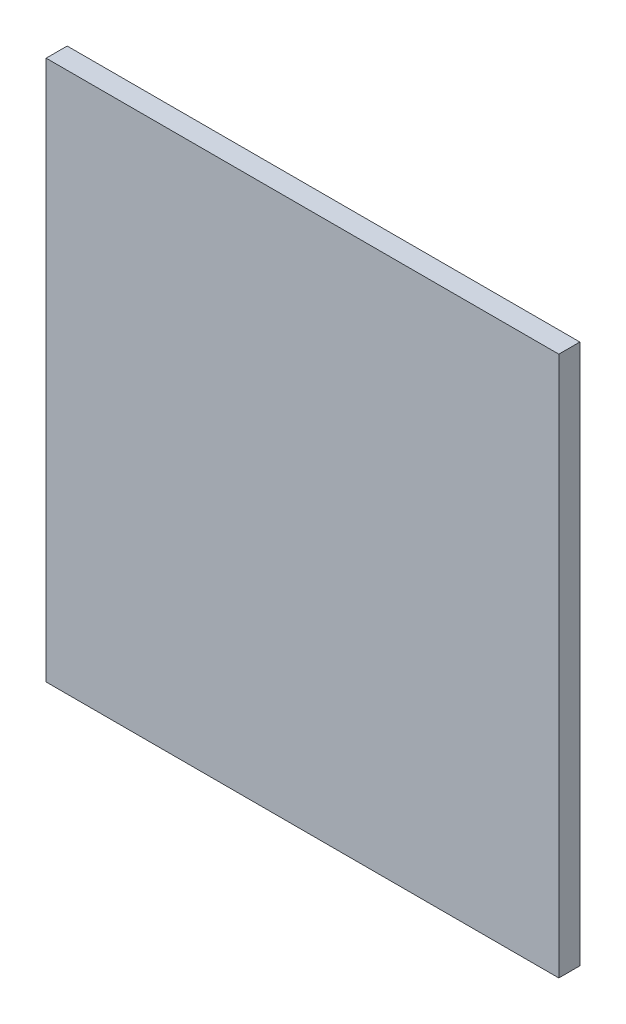
ISO-10303-21;
HEADER;
FILE_DESCRIPTION(('STEP AP214'),'2;1');
FILE_NAME('part.step','',(''),(''),'','','');
FILE_SCHEMA(('AUTOMOTIVE_DESIGN { 1 0 10303 214 1 1 1 1 }'));
ENDSEC;
DATA;
#1=APPLICATION_CONTEXT('core data for automotive mechanical design processes');
#2=APPLICATION_PROTOCOL_DEFINITION('international standard','automotive_design',2000,#1);
#3=PRODUCT_CONTEXT('',#1,'mechanical');
#4=PRODUCT('Part','Part','',(#3));
#5=PRODUCT_RELATED_PRODUCT_CATEGORY('part','',(#4));
#6=PRODUCT_DEFINITION_FORMATION('','',#4);
#7=PRODUCT_DEFINITION_CONTEXT('part definition',#1,'design');
#8=PRODUCT_DEFINITION('design','',#6,#7);
#9=PRODUCT_DEFINITION_SHAPE('','',#8);
#10=(LENGTH_UNIT() NAMED_UNIT(*) SI_UNIT(.MILLI.,.METRE.));
#11=(NAMED_UNIT(*) PLANE_ANGLE_UNIT() SI_UNIT($,.RADIAN.));
#12=(NAMED_UNIT(*) SI_UNIT($,.STERADIAN.) SOLID_ANGLE_UNIT());
#13=UNCERTAINTY_MEASURE_WITH_UNIT(LENGTH_MEASURE(1.E-05),#10,'distance_accuracy_value','');
#14=(GEOMETRIC_REPRESENTATION_CONTEXT(3) GLOBAL_UNCERTAINTY_ASSIGNED_CONTEXT((#13)) GLOBAL_UNIT_ASSIGNED_CONTEXT((#10,
#11,#12)) REPRESENTATION_CONTEXT('',''));
#15=CARTESIAN_POINT('',(0.,0.,0.));
#16=DIRECTION('',(0.,0.,1.));
#17=DIRECTION('',(1.,0.,0.));
#18=AXIS2_PLACEMENT_3D('',#15,#16,#17);
#19=CARTESIAN_POINT('',(0.,0.,45.));
#20=DIRECTION('',(1.,0.,0.));
#21=DIRECTION('',(0.,0.,-1.));
#22=AXIS2_PLACEMENT_3D('',#19,#20,#21);
#23=PLANE('',#22);
#24=DIRECTION('',(0.,-1.,0.));
#25=VECTOR('',#24,1.);
#26=CARTESIAN_POINT('',(0.,0.,0.));
#27=LINE('',#26,#25);
#28=CARTESIAN_POINT('',(0.,1155.,0.));
#29=VERTEX_POINT('',#28);
#30=CARTESIAN_POINT('',(0.,0.,0.));
#31=VERTEX_POINT('',#30);
#32=EDGE_CURVE('E97',#29,#31,#27,.T.);
#33=ORIENTED_EDGE('',*,*,#32,.T.);
#34=DIRECTION('',(0.,0.,-1.));
#35=VECTOR('',#34,1.);
#36=CARTESIAN_POINT('',(0.,0.,45.));
#37=LINE('',#36,#35);
#38=CARTESIAN_POINT('',(0.,0.,45.));
#39=VERTEX_POINT('',#38);
#40=EDGE_CURVE('E11',#39,#31,#37,.T.);
#41=ORIENTED_EDGE('',*,*,#40,.F.);
#42=DIRECTION('',(0.,-1.,0.));
#43=VECTOR('',#42,1.);
#44=CARTESIAN_POINT('',(0.,0.,45.));
#45=LINE('',#44,#43);
#46=CARTESIAN_POINT('',(0.,1155.,45.));
#47=VERTEX_POINT('',#46);
#48=EDGE_CURVE('E85',#47,#39,#45,.T.);
#49=ORIENTED_EDGE('',*,*,#48,.F.);
#50=DIRECTION('',(0.,0.,-1.));
#51=VECTOR('',#50,1.);
#52=CARTESIAN_POINT('',(0.,1155.,45.));
#53=LINE('',#52,#51);
#54=EDGE_CURVE('E93',#47,#29,#53,.T.);
#55=ORIENTED_EDGE('',*,*,#54,.T.);
#56=EDGE_LOOP('',(#33,#41,#49,#55));
#57=FACE_BOUND('',#56,.T.);
#58=ADVANCED_FACE('F34',(#57),#23,.F.);
#59=CARTESIAN_POINT('',(0.,0.,45.));
#60=DIRECTION('',(0.,1.,0.));
#61=DIRECTION('',(0.,0.,1.));
#62=AXIS2_PLACEMENT_3D('',#59,#60,#61);
#63=PLANE('',#62);
#64=DIRECTION('',(1.,0.,0.));
#65=VECTOR('',#64,1.);
#66=CARTESIAN_POINT('',(0.,0.,0.));
#67=LINE('',#66,#65);
#68=CARTESIAN_POINT('',(1096.,0.,0.));
#69=VERTEX_POINT('',#68);
#70=EDGE_CURVE('E89',#31,#69,#67,.T.);
#71=ORIENTED_EDGE('',*,*,#70,.T.);
#72=DIRECTION('',(0.,0.,-1.));
#73=VECTOR('',#72,1.);
#74=CARTESIAN_POINT('',(1096.,0.,45.));
#75=LINE('',#74,#73);
#76=CARTESIAN_POINT('',(1096.,0.,45.));
#77=VERTEX_POINT('',#76);
#78=EDGE_CURVE('E42',#77,#69,#75,.T.);
#79=ORIENTED_EDGE('',*,*,#78,.F.);
#80=DIRECTION('',(1.,0.,0.));
#81=VECTOR('',#80,1.);
#82=CARTESIAN_POINT('',(0.,0.,45.));
#83=LINE('',#82,#81);
#84=EDGE_CURVE('E80',#39,#77,#83,.T.);
#85=ORIENTED_EDGE('',*,*,#84,.F.);
#86=ORIENTED_EDGE('',*,*,#40,.T.);
#87=EDGE_LOOP('',(#71,#79,#85,#86));
#88=FACE_BOUND('',#87,.T.);
#89=ADVANCED_FACE('F88',(#88),#63,.F.);
#90=CARTESIAN_POINT('',(1096.,0.,45.));
#91=DIRECTION('',(-1.,0.,0.));
#92=DIRECTION('',(0.,0.,1.));
#93=AXIS2_PLACEMENT_3D('',#90,#91,#92);
#94=PLANE('',#93);
#95=DIRECTION('',(0.,1.,0.));
#96=VECTOR('',#95,1.);
#97=CARTESIAN_POINT('',(1096.,0.,0.));
#98=LINE('',#97,#96);
#99=CARTESIAN_POINT('',(1096.,1155.,0.));
#100=VERTEX_POINT('',#99);
#101=EDGE_CURVE('E67',#69,#100,#98,.T.);
#102=ORIENTED_EDGE('',*,*,#101,.T.);
#103=DIRECTION('',(0.,0.,-1.));
#104=VECTOR('',#103,1.);
#105=CARTESIAN_POINT('',(1096.,1155.,45.));
#106=LINE('',#105,#104);
#107=CARTESIAN_POINT('',(1096.,1155.,45.));
#108=VERTEX_POINT('',#107);
#109=EDGE_CURVE('E90',#108,#100,#106,.T.);
#110=ORIENTED_EDGE('',*,*,#109,.F.);
#111=DIRECTION('',(0.,1.,0.));
#112=VECTOR('',#111,1.);
#113=CARTESIAN_POINT('',(1096.,0.,45.));
#114=LINE('',#113,#112);
#115=EDGE_CURVE('E83',#77,#108,#114,.T.);
#116=ORIENTED_EDGE('',*,*,#115,.F.);
#117=ORIENTED_EDGE('',*,*,#78,.T.);
#118=EDGE_LOOP('',(#102,#110,#116,#117));
#119=FACE_BOUND('',#118,.T.);
#120=ADVANCED_FACE('F91',(#119),#94,.F.);
#121=CARTESIAN_POINT('',(0.,1155.,45.));
#122=DIRECTION('',(0.,-1.,0.));
#123=DIRECTION('',(0.,0.,-1.));
#124=AXIS2_PLACEMENT_3D('',#121,#122,#123);
#125=PLANE('',#124);
#126=DIRECTION('',(-1.,0.,0.));
#127=VECTOR('',#126,1.);
#128=CARTESIAN_POINT('',(0.,1155.,0.));
#129=LINE('',#128,#127);
#130=EDGE_CURVE('E73',#100,#29,#129,.T.);
#131=ORIENTED_EDGE('',*,*,#130,.T.);
#132=ORIENTED_EDGE('',*,*,#54,.F.);
#133=DIRECTION('',(-1.,0.,0.));
#134=VECTOR('',#133,1.);
#135=CARTESIAN_POINT('',(0.,1155.,45.));
#136=LINE('',#135,#134);
#137=EDGE_CURVE('E50',#108,#47,#136,.T.);
#138=ORIENTED_EDGE('',*,*,#137,.F.);
#139=ORIENTED_EDGE('',*,*,#109,.T.);
#140=EDGE_LOOP('',(#131,#132,#138,#139));
#141=FACE_BOUND('',#140,.T.);
#142=ADVANCED_FACE('F104',(#141),#125,.F.);
#143=CARTESIAN_POINT('',(0.,0.,45.));
#144=DIRECTION('',(0.,0.,-1.));
#145=DIRECTION('',(-1.,0.,0.));
#146=AXIS2_PLACEMENT_3D('',#143,#144,#145);
#147=PLANE('',#146);
#148=ORIENTED_EDGE('',*,*,#48,.T.);
#149=ORIENTED_EDGE('',*,*,#84,.T.);
#150=ORIENTED_EDGE('',*,*,#115,.T.);
#151=ORIENTED_EDGE('',*,*,#137,.T.);
#152=EDGE_LOOP('',(#148,#149,#150,#151));
#153=FACE_BOUND('',#152,.T.);
#154=ADVANCED_FACE('F81',(#153),#147,.F.);
#155=CARTESIAN_POINT('',(0.,0.,0.));
#156=DIRECTION('',(0.,0.,-1.));
#157=DIRECTION('',(-1.,0.,0.));
#158=AXIS2_PLACEMENT_3D('',#155,#156,#157);
#159=PLANE('',#158);
#160=ORIENTED_EDGE('',*,*,#32,.F.);
#161=ORIENTED_EDGE('',*,*,#130,.F.);
#162=ORIENTED_EDGE('',*,*,#101,.F.);
#163=ORIENTED_EDGE('',*,*,#70,.F.);
#164=EDGE_LOOP('',(#160,#161,#162,#163));
#165=FACE_BOUND('',#164,.T.);
#166=ADVANCED_FACE('F107',(#165),#159,.T.);
#167=CLOSED_SHELL('',(#58,#89,#120,#142,#154,#166));
#168=MANIFOLD_SOLID_BREP('B2',#167);
#169=ADVANCED_BREP_SHAPE_REPRESENTATION('',(#18,#168),#14);
#170=SHAPE_DEFINITION_REPRESENTATION(#9,#169);
ENDSEC;
END-ISO-10303-21;
